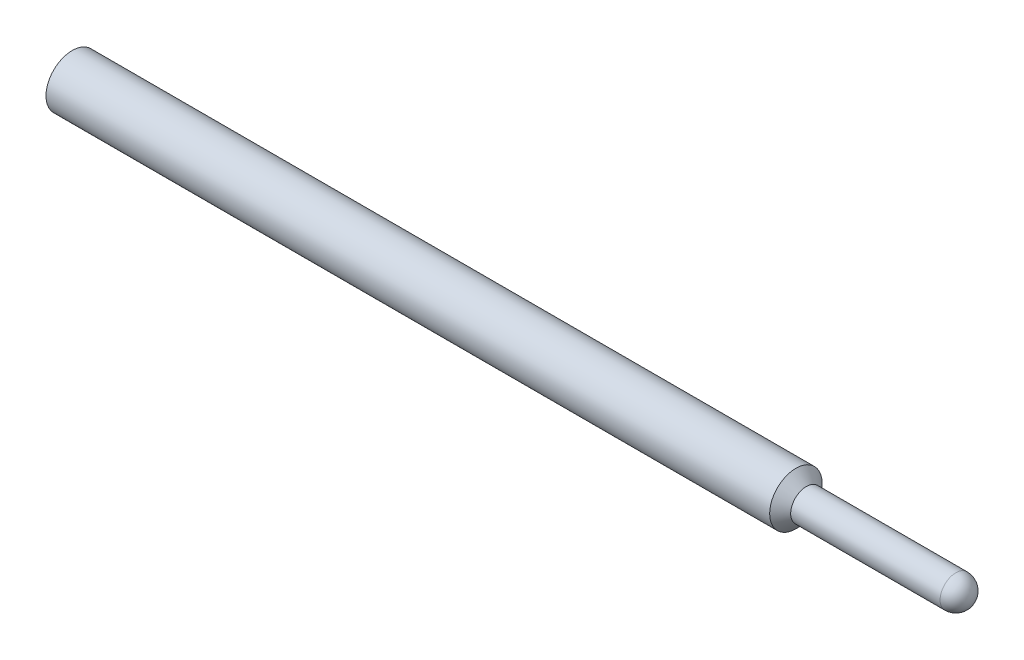
ISO-10303-21;
HEADER;
FILE_DESCRIPTION(('STEP AP214'),'2;1');
FILE_NAME('part.step','',(''),(''),'','','');
FILE_SCHEMA(('AUTOMOTIVE_DESIGN { 1 0 10303 214 1 1 1 1 }'));
ENDSEC;
DATA;
#1=APPLICATION_CONTEXT('core data for automotive mechanical design processes');
#2=APPLICATION_PROTOCOL_DEFINITION('international standard','automotive_design',2000,#1);
#3=PRODUCT_CONTEXT('',#1,'mechanical');
#4=PRODUCT('Part','Part','',(#3));
#5=PRODUCT_RELATED_PRODUCT_CATEGORY('part','',(#4));
#6=PRODUCT_DEFINITION_FORMATION('','',#4);
#7=PRODUCT_DEFINITION_CONTEXT('part definition',#1,'design');
#8=PRODUCT_DEFINITION('design','',#6,#7);
#9=PRODUCT_DEFINITION_SHAPE('','',#8);
#10=(LENGTH_UNIT() NAMED_UNIT(*) SI_UNIT(.MILLI.,.METRE.));
#11=(NAMED_UNIT(*) PLANE_ANGLE_UNIT() SI_UNIT($,.RADIAN.));
#12=(NAMED_UNIT(*) SI_UNIT($,.STERADIAN.) SOLID_ANGLE_UNIT());
#13=UNCERTAINTY_MEASURE_WITH_UNIT(LENGTH_MEASURE(1.E-05),#10,'distance_accuracy_value','');
#14=(GEOMETRIC_REPRESENTATION_CONTEXT(3) GLOBAL_UNCERTAINTY_ASSIGNED_CONTEXT((#13)) GLOBAL_UNIT_ASSIGNED_CONTEXT((#10,
#11,#12)) REPRESENTATION_CONTEXT('',''));
#15=CARTESIAN_POINT('',(0.,0.,0.));
#16=DIRECTION('',(0.,0.,1.));
#17=DIRECTION('',(1.,0.,0.));
#18=AXIS2_PLACEMENT_3D('',#15,#16,#17);
#19=CARTESIAN_POINT('',(0.,0.,0.));
#20=DIRECTION('',(1.,0.,0.));
#21=DIRECTION('',(0.,1.,0.));
#22=AXIS2_PLACEMENT_3D('',#19,#20,#21);
#23=PLANE('',#22);
#24=CARTESIAN_POINT('',(0.,0.,0.));
#25=DIRECTION('',(-1.,0.,0.));
#26=DIRECTION('',(0.,-1.,0.));
#27=AXIS2_PLACEMENT_3D('',#24,#25,#26);
#28=CIRCLE('',#27,10.);
#29=CARTESIAN_POINT('',(0.,-10.,0.));
#30=VERTEX_POINT('',#29);
#31=EDGE_CURVE('E10',#30,#30,#28,.T.);
#32=ORIENTED_EDGE('',*,*,#31,.T.);
#33=EDGE_LOOP('',(#32));
#34=FACE_BOUND('',#33,.T.);
#35=ADVANCED_FACE('F35',(#34),#23,.F.);
#36=CARTESIAN_POINT('',(0.,0.,0.));
#37=DIRECTION('',(-1.,0.,0.));
#38=DIRECTION('',(0.,-1.,0.));
#39=AXIS2_PLACEMENT_3D('',#36,#37,#38);
#40=CYLINDRICAL_SURFACE('',#39,10.);
#41=ORIENTED_EDGE('',*,*,#31,.F.);
#42=EDGE_LOOP('',(#41));
#43=FACE_BOUND('',#42,.T.);
#44=CARTESIAN_POINT('',(276.,0.,0.));
#45=DIRECTION('',(-1.,0.,0.));
#46=DIRECTION('',(0.,-1.,0.));
#47=AXIS2_PLACEMENT_3D('',#44,#45,#46);
#48=CIRCLE('',#47,10.);
#49=CARTESIAN_POINT('',(276.,-10.,0.));
#50=VERTEX_POINT('',#49);
#51=EDGE_CURVE('E41',#50,#50,#48,.T.);
#52=ORIENTED_EDGE('',*,*,#51,.T.);
#53=EDGE_LOOP('',(#52));
#54=FACE_BOUND('',#53,.T.);
#55=ADVANCED_FACE('F67',(#43,#54),#40,.T.);
#56=CARTESIAN_POINT('',(280.,0.,0.));
#57=DIRECTION('',(-1.,0.,0.));
#58=DIRECTION('',(0.,-1.,0.));
#59=AXIS2_PLACEMENT_3D('',#56,#57,#58);
#60=CONICAL_SURFACE('',#59,6.,0.785398163397448);
#61=ORIENTED_EDGE('',*,*,#51,.F.);
#62=EDGE_LOOP('',(#61));
#63=FACE_BOUND('',#62,.T.);
#64=CARTESIAN_POINT('',(280.,0.,0.));
#65=DIRECTION('',(-1.,0.,0.));
#66=DIRECTION('',(0.,-1.,0.));
#67=AXIS2_PLACEMENT_3D('',#64,#65,#66);
#68=CIRCLE('',#67,6.);
#69=CARTESIAN_POINT('',(280.,-6.,0.));
#70=VERTEX_POINT('',#69);
#71=EDGE_CURVE('E45',#70,#70,#68,.T.);
#72=ORIENTED_EDGE('',*,*,#71,.T.);
#73=EDGE_LOOP('',(#72));
#74=FACE_BOUND('',#73,.T.);
#75=ADVANCED_FACE('F63',(#63,#74),#60,.T.);
#76=CARTESIAN_POINT('',(0.,0.,0.));
#77=DIRECTION('',(-1.,0.,0.));
#78=DIRECTION('',(0.,-1.,0.));
#79=AXIS2_PLACEMENT_3D('',#76,#77,#78);
#80=CYLINDRICAL_SURFACE('',#79,6.);
#81=ORIENTED_EDGE('',*,*,#71,.F.);
#82=EDGE_LOOP('',(#81));
#83=FACE_BOUND('',#82,.T.);
#84=CARTESIAN_POINT('',(337.,0.,0.));
#85=DIRECTION('',(-1.,0.,0.));
#86=DIRECTION('',(0.,-1.,0.));
#87=AXIS2_PLACEMENT_3D('',#84,#85,#86);
#88=CIRCLE('',#87,6.);
#89=CARTESIAN_POINT('',(337.,-6.,0.));
#90=VERTEX_POINT('',#89);
#91=EDGE_CURVE('E49',#90,#90,#88,.T.);
#92=ORIENTED_EDGE('',*,*,#91,.T.);
#93=EDGE_LOOP('',(#92));
#94=FACE_BOUND('',#93,.T.);
#95=ADVANCED_FACE('F55',(#83,#94),#80,.T.);
#96=CARTESIAN_POINT('',(337.,0.,0.));
#97=DIRECTION('',(-1.,0.,0.));
#98=DIRECTION('',(0.,1.,0.));
#99=AXIS2_PLACEMENT_3D('',#96,#97,#98);
#100=SPHERICAL_SURFACE('',#99,6.);
#101=ORIENTED_EDGE('',*,*,#91,.F.);
#102=EDGE_LOOP('',(#101));
#103=FACE_BOUND('',#102,.T.);
#104=ADVANCED_FACE('F57',(#103),#100,.T.);
#105=CLOSED_SHELL('',(#35,#55,#75,#95,#104));
#106=MANIFOLD_SOLID_BREP('B2',#105);
#107=ADVANCED_BREP_SHAPE_REPRESENTATION('',(#18,#106),#14);
#108=SHAPE_DEFINITION_REPRESENTATION(#9,#107);
ENDSEC;
END-ISO-10303-21;
